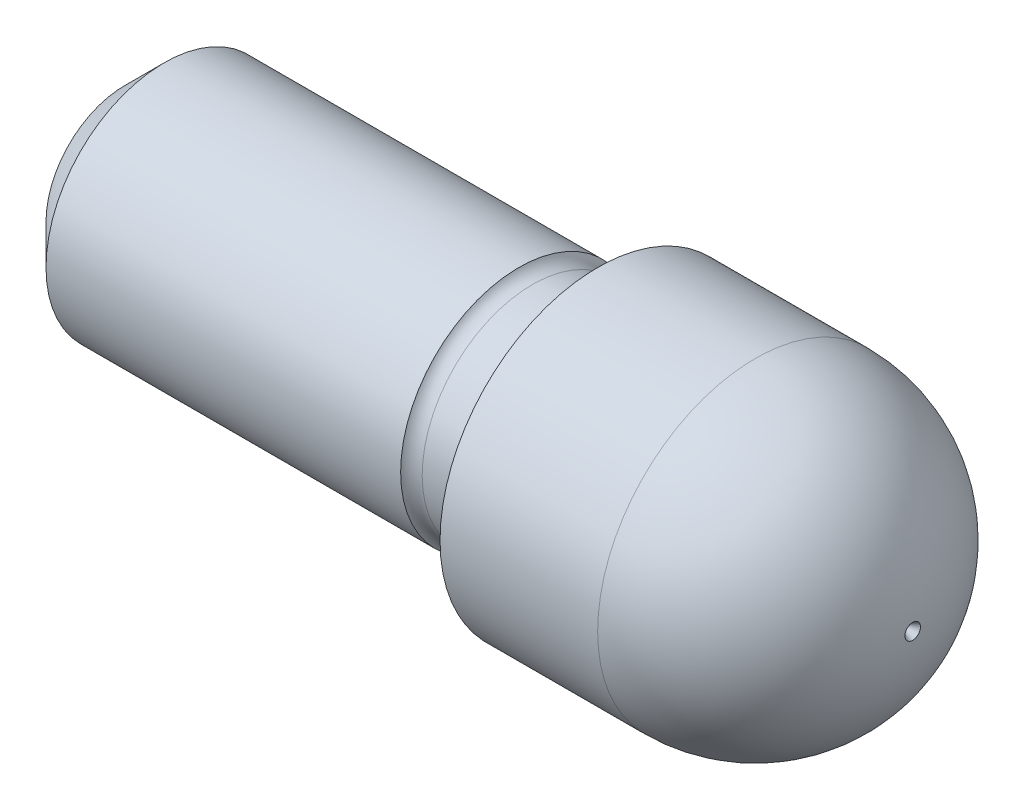
ISO-10303-21;
HEADER;
FILE_DESCRIPTION(('STEP AP214'),'2;1');
FILE_NAME('part.step','',(''),(''),'','','');
FILE_SCHEMA(('AUTOMOTIVE_DESIGN { 1 0 10303 214 1 1 1 1 }'));
ENDSEC;
DATA;
#1=APPLICATION_CONTEXT('core data for automotive mechanical design processes');
#2=APPLICATION_PROTOCOL_DEFINITION('international standard','automotive_design',2000,#1);
#3=PRODUCT_CONTEXT('',#1,'mechanical');
#4=PRODUCT('Part','Part','',(#3));
#5=PRODUCT_RELATED_PRODUCT_CATEGORY('part','',(#4));
#6=PRODUCT_DEFINITION_FORMATION('','',#4);
#7=PRODUCT_DEFINITION_CONTEXT('part definition',#1,'design');
#8=PRODUCT_DEFINITION('design','',#6,#7);
#9=PRODUCT_DEFINITION_SHAPE('','',#8);
#10=(LENGTH_UNIT() NAMED_UNIT(*) SI_UNIT(.MILLI.,.METRE.));
#11=(NAMED_UNIT(*) PLANE_ANGLE_UNIT() SI_UNIT($,.RADIAN.));
#12=(NAMED_UNIT(*) SI_UNIT($,.STERADIAN.) SOLID_ANGLE_UNIT());
#13=UNCERTAINTY_MEASURE_WITH_UNIT(LENGTH_MEASURE(1.E-05),#10,'distance_accuracy_value','');
#14=(GEOMETRIC_REPRESENTATION_CONTEXT(3) GLOBAL_UNCERTAINTY_ASSIGNED_CONTEXT((#13)) GLOBAL_UNIT_ASSIGNED_CONTEXT((#10,
#11,#12)) REPRESENTATION_CONTEXT('',''));
#15=CARTESIAN_POINT('',(0.,0.,0.));
#16=DIRECTION('',(0.,0.,1.));
#17=DIRECTION('',(1.,0.,0.));
#18=AXIS2_PLACEMENT_3D('',#15,#16,#17);
#19=CARTESIAN_POINT('',(2.,0.,0.));
#20=DIRECTION('',(-1.,0.,0.));
#21=DIRECTION('',(0.,1.,0.));
#22=AXIS2_PLACEMENT_3D('',#19,#20,#21);
#23=SPHERICAL_SURFACE('',#22,2.);
#24=CARTESIAN_POINT('',(3.99756822803821,0.,0.));
#25=DIRECTION('',(-1.,0.,0.));
#26=DIRECTION('',(0.,0.,1.));
#27=AXIS2_PLACEMENT_3D('',#24,#25,#26);
#28=CIRCLE('',#27,0.0985960158032596);
#29=CARTESIAN_POINT('',(3.99756822803821,0.,0.0985960158032596));
#30=VERTEX_POINT('',#29);
#31=EDGE_CURVE('E11',#30,#30,#28,.T.);
#32=ORIENTED_EDGE('',*,*,#31,.T.);
#33=EDGE_LOOP('',(#32));
#34=FACE_BOUND('',#33,.T.);
#35=CARTESIAN_POINT('',(2.,0.,0.));
#36=DIRECTION('',(-1.,0.,0.));
#37=DIRECTION('',(0.,0.,1.));
#38=AXIS2_PLACEMENT_3D('',#35,#36,#37);
#39=CIRCLE('',#38,2.);
#40=CARTESIAN_POINT('',(2.,0.,2.));
#41=VERTEX_POINT('',#40);
#42=EDGE_CURVE('E60',#41,#41,#39,.T.);
#43=ORIENTED_EDGE('',*,*,#42,.F.);
#44=EDGE_LOOP('',(#43));
#45=FACE_BOUND('',#44,.T.);
#46=ADVANCED_FACE('F37',(#34,#45),#23,.T.);
#47=CARTESIAN_POINT('',(3.99756822803821,0.,0.));
#48=DIRECTION('',(1.,0.,0.));
#49=DIRECTION('',(0.,0.,-1.));
#50=AXIS2_PLACEMENT_3D('',#47,#48,#49);
#51=CONICAL_SURFACE('',#50,0.0985960158032596,0.523598775598288);
#52=CARTESIAN_POINT('',(3.8267949192431,0.,0.));
#53=VERTEX_POINT('',#52);
#54=VERTEX_LOOP('',#53);
#55=FACE_BOUND('',#54,.T.);
#56=ORIENTED_EDGE('',*,*,#31,.F.);
#57=EDGE_LOOP('',(#56));
#58=FACE_BOUND('',#57,.T.);
#59=ADVANCED_FACE('F50',(#55,#58),#51,.F.);
#60=CARTESIAN_POINT('',(-5.8267949192431,0.,0.));
#61=DIRECTION('',(-1.,0.,0.));
#62=DIRECTION('',(0.,0.,1.));
#63=AXIS2_PLACEMENT_3D('',#60,#61,#62);
#64=CONICAL_SURFACE('',#63,0.,0.523598775598285);
#65=CARTESIAN_POINT('',(-6.,0.,0.));
#66=DIRECTION('',(-1.,0.,0.));
#67=DIRECTION('',(0.,0.,1.));
#68=AXIS2_PLACEMENT_3D('',#65,#66,#67);
#69=CIRCLE('',#68,0.100000000000005);
#70=CARTESIAN_POINT('',(-6.,0.,0.100000000000005));
#71=VERTEX_POINT('',#70);
#72=EDGE_CURVE('E44',#71,#71,#69,.T.);
#73=ORIENTED_EDGE('',*,*,#72,.T.);
#74=EDGE_LOOP('',(#73));
#75=FACE_BOUND('',#74,.T.);
#76=CARTESIAN_POINT('',(-5.8267949192431,0.,0.));
#77=VERTEX_POINT('',#76);
#78=VERTEX_LOOP('',#77);
#79=FACE_BOUND('',#78,.T.);
#80=ADVANCED_FACE('F53',(#75,#79),#64,.F.);
#81=CARTESIAN_POINT('',(-6.,0.100000000000005,0.));
#82=DIRECTION('',(-1.,0.,0.));
#83=DIRECTION('',(0.,0.,1.));
#84=AXIS2_PLACEMENT_3D('',#81,#82,#83);
#85=PLANE('',#84);
#86=CARTESIAN_POINT('',(-6.,0.,0.));
#87=DIRECTION('',(-1.,0.,0.));
#88=DIRECTION('',(0.,0.,1.));
#89=AXIS2_PLACEMENT_3D('',#86,#87,#88);
#90=CIRCLE('',#89,1.);
#91=CARTESIAN_POINT('',(-6.,0.,1.));
#92=VERTEX_POINT('',#91);
#93=EDGE_CURVE('E82',#92,#92,#90,.T.);
#94=ORIENTED_EDGE('',*,*,#93,.T.);
#95=EDGE_LOOP('',(#94));
#96=FACE_BOUND('',#95,.T.);
#97=ORIENTED_EDGE('',*,*,#72,.F.);
#98=EDGE_LOOP('',(#97));
#99=FACE_BOUND('',#98,.T.);
#100=ADVANCED_FACE('F88',(#96,#99),#85,.T.);
#101=CARTESIAN_POINT('',(-6.,0.,0.));
#102=DIRECTION('',(1.,0.,0.));
#103=DIRECTION('',(0.,0.,-1.));
#104=AXIS2_PLACEMENT_3D('',#101,#102,#103);
#105=CONICAL_SURFACE('',#104,1.,0.785398163397448);
#106=CARTESIAN_POINT('',(-5.5,0.,0.));
#107=DIRECTION('',(-1.,0.,0.));
#108=DIRECTION('',(0.,0.,1.));
#109=AXIS2_PLACEMENT_3D('',#106,#107,#108);
#110=CIRCLE('',#109,1.5);
#111=CARTESIAN_POINT('',(-5.5,0.,1.5));
#112=VERTEX_POINT('',#111);
#113=EDGE_CURVE('E79',#112,#112,#110,.T.);
#114=ORIENTED_EDGE('',*,*,#113,.T.);
#115=EDGE_LOOP('',(#114));
#116=FACE_BOUND('',#115,.T.);
#117=ORIENTED_EDGE('',*,*,#93,.F.);
#118=EDGE_LOOP('',(#117));
#119=FACE_BOUND('',#118,.T.);
#120=ADVANCED_FACE('F90',(#116,#119),#105,.T.);
#121=CARTESIAN_POINT('',(4.00235458868505,0.,0.));
#122=DIRECTION('',(-1.,0.,0.));
#123=DIRECTION('',(0.,0.,1.));
#124=AXIS2_PLACEMENT_3D('',#121,#122,#123);
#125=CYLINDRICAL_SURFACE('',#124,1.5);
#126=CARTESIAN_POINT('',(-1.,0.,0.));
#127=DIRECTION('',(-1.,0.,0.));
#128=DIRECTION('',(0.,0.,1.));
#129=AXIS2_PLACEMENT_3D('',#126,#127,#128);
#130=CIRCLE('',#129,1.5);
#131=CARTESIAN_POINT('',(-1.,0.,1.5));
#132=VERTEX_POINT('',#131);
#133=EDGE_CURVE('E76',#132,#132,#130,.T.);
#134=ORIENTED_EDGE('',*,*,#133,.T.);
#135=EDGE_LOOP('',(#134));
#136=FACE_BOUND('',#135,.T.);
#137=ORIENTED_EDGE('',*,*,#113,.F.);
#138=EDGE_LOOP('',(#137));
#139=FACE_BOUND('',#138,.T.);
#140=ADVANCED_FACE('F97',(#136,#139),#125,.T.);
#141=CARTESIAN_POINT('',(-0.826794919243148,0.,0.));
#142=DIRECTION('',(-1.,0.,0.));
#143=DIRECTION('',(0.,0.,1.));
#144=AXIS2_PLACEMENT_3D('',#141,#142,#143);
#145=TOROIDAL_SURFACE('',#144,1.59999999999994,0.199999999999939);
#146=CARTESIAN_POINT('',(-0.826794919243111,0.,0.));
#147=DIRECTION('',(-1.,0.,0.));
#148=DIRECTION('',(0.,0.,1.));
#149=AXIS2_PLACEMENT_3D('',#146,#147,#148);
#150=CIRCLE('',#149,1.4);
#151=CARTESIAN_POINT('',(-0.826794919243111,0.,1.4));
#152=VERTEX_POINT('',#151);
#153=EDGE_CURVE('E73',#152,#152,#150,.T.);
#154=ORIENTED_EDGE('',*,*,#153,.T.);
#155=EDGE_LOOP('',(#154));
#156=FACE_BOUND('',#155,.T.);
#157=ORIENTED_EDGE('',*,*,#133,.F.);
#158=EDGE_LOOP('',(#157));
#159=FACE_BOUND('',#158,.T.);
#160=ADVANCED_FACE('F104',(#156,#159),#145,.F.);
#161=CARTESIAN_POINT('',(4.00235458868505,0.,0.));
#162=DIRECTION('',(-1.,0.,0.));
#163=DIRECTION('',(0.,0.,1.));
#164=AXIS2_PLACEMENT_3D('',#161,#162,#163);
#165=CYLINDRICAL_SURFACE('',#164,1.4);
#166=CARTESIAN_POINT('',(-0.199999999999999,0.,0.));
#167=DIRECTION('',(-1.,0.,0.));
#168=DIRECTION('',(0.,0.,1.));
#169=AXIS2_PLACEMENT_3D('',#166,#167,#168);
#170=CIRCLE('',#169,1.4);
#171=CARTESIAN_POINT('',(-0.199999999999999,0.,1.4));
#172=VERTEX_POINT('',#171);
#173=EDGE_CURVE('E70',#172,#172,#170,.T.);
#174=ORIENTED_EDGE('',*,*,#173,.T.);
#175=EDGE_LOOP('',(#174));
#176=FACE_BOUND('',#175,.T.);
#177=ORIENTED_EDGE('',*,*,#153,.F.);
#178=EDGE_LOOP('',(#177));
#179=FACE_BOUND('',#178,.T.);
#180=ADVANCED_FACE('F108',(#176,#179),#165,.T.);
#181=CARTESIAN_POINT('',(-0.200000000000015,0.,0.));
#182=DIRECTION('',(-1.,0.,0.));
#183=DIRECTION('',(0.,0.,1.));
#184=AXIS2_PLACEMENT_3D('',#181,#182,#183);
#185=TOROIDAL_SURFACE('',#184,1.6,0.200000000000008);
#186=CARTESIAN_POINT('',(0.,0.,0.));
#187=DIRECTION('',(-1.,0.,0.));
#188=DIRECTION('',(0.,0.,1.));
#189=AXIS2_PLACEMENT_3D('',#186,#187,#188);
#190=CIRCLE('',#189,1.6);
#191=CARTESIAN_POINT('',(0.,0.,1.6));
#192=VERTEX_POINT('',#191);
#193=EDGE_CURVE('E65',#192,#192,#190,.T.);
#194=ORIENTED_EDGE('',*,*,#193,.T.);
#195=EDGE_LOOP('',(#194));
#196=FACE_BOUND('',#195,.T.);
#197=ORIENTED_EDGE('',*,*,#173,.F.);
#198=EDGE_LOOP('',(#197));
#199=FACE_BOUND('',#198,.T.);
#200=ADVANCED_FACE('F112',(#196,#199),#185,.F.);
#201=CARTESIAN_POINT('',(0.,1.6,0.));
#202=DIRECTION('',(-1.,0.,0.));
#203=DIRECTION('',(0.,0.,1.));
#204=AXIS2_PLACEMENT_3D('',#201,#202,#203);
#205=PLANE('',#204);
#206=CARTESIAN_POINT('',(0.,0.,0.));
#207=DIRECTION('',(-1.,0.,0.));
#208=DIRECTION('',(0.,0.,1.));
#209=AXIS2_PLACEMENT_3D('',#206,#207,#208);
#210=CIRCLE('',#209,2.);
#211=CARTESIAN_POINT('',(0.,0.,2.));
#212=VERTEX_POINT('',#211);
#213=EDGE_CURVE('E62',#212,#212,#210,.T.);
#214=ORIENTED_EDGE('',*,*,#213,.T.);
#215=EDGE_LOOP('',(#214));
#216=FACE_BOUND('',#215,.T.);
#217=ORIENTED_EDGE('',*,*,#193,.F.);
#218=EDGE_LOOP('',(#217));
#219=FACE_BOUND('',#218,.T.);
#220=ADVANCED_FACE('F116',(#216,#219),#205,.T.);
#221=CARTESIAN_POINT('',(4.00235458868505,0.,0.));
#222=DIRECTION('',(-1.,0.,0.));
#223=DIRECTION('',(0.,0.,1.));
#224=AXIS2_PLACEMENT_3D('',#221,#222,#223);
#225=CYLINDRICAL_SURFACE('',#224,2.);
#226=ORIENTED_EDGE('',*,*,#42,.T.);
#227=EDGE_LOOP('',(#226));
#228=FACE_BOUND('',#227,.T.);
#229=ORIENTED_EDGE('',*,*,#213,.F.);
#230=EDGE_LOOP('',(#229));
#231=FACE_BOUND('',#230,.T.);
#232=ADVANCED_FACE('F120',(#228,#231),#225,.T.);
#233=CLOSED_SHELL('',(#46,#59,#80,#100,#120,#140,#160,#180,#200,#220,#232));
#234=MANIFOLD_SOLID_BREP('B2',#233);
#235=ADVANCED_BREP_SHAPE_REPRESENTATION('',(#18,#234),#14);
#236=SHAPE_DEFINITION_REPRESENTATION(#9,#235);
ENDSEC;
END-ISO-10303-21;
